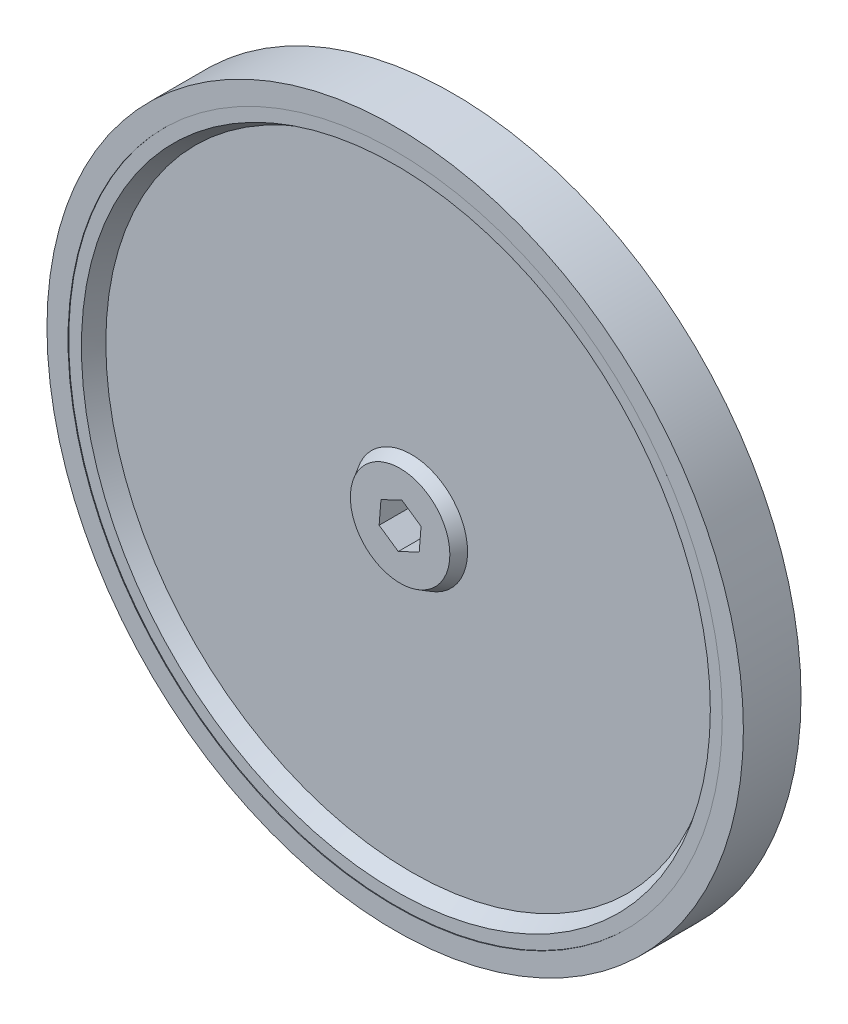
ISO-10303-21;
HEADER;
FILE_DESCRIPTION(('STEP AP214'),'2;1');
FILE_NAME('part.step','',(''),(''),'','','');
FILE_SCHEMA(('AUTOMOTIVE_DESIGN { 1 0 10303 214 1 1 1 1 }'));
ENDSEC;
DATA;
#1=APPLICATION_CONTEXT('core data for automotive mechanical design processes');
#2=APPLICATION_PROTOCOL_DEFINITION('international standard','automotive_design',2000,#1);
#3=PRODUCT_CONTEXT('',#1,'mechanical');
#4=PRODUCT('Part','Part','',(#3));
#5=PRODUCT_RELATED_PRODUCT_CATEGORY('part','',(#4));
#6=PRODUCT_DEFINITION_FORMATION('','',#4);
#7=PRODUCT_DEFINITION_CONTEXT('part definition',#1,'design');
#8=PRODUCT_DEFINITION('design','',#6,#7);
#9=PRODUCT_DEFINITION_SHAPE('','',#8);
#10=(LENGTH_UNIT() NAMED_UNIT(*) SI_UNIT(.MILLI.,.METRE.));
#11=(NAMED_UNIT(*) PLANE_ANGLE_UNIT() SI_UNIT($,.RADIAN.));
#12=(NAMED_UNIT(*) SI_UNIT($,.STERADIAN.) SOLID_ANGLE_UNIT());
#13=UNCERTAINTY_MEASURE_WITH_UNIT(LENGTH_MEASURE(1.E-05),#10,'distance_accuracy_value','');
#14=(GEOMETRIC_REPRESENTATION_CONTEXT(3) GLOBAL_UNCERTAINTY_ASSIGNED_CONTEXT((#13)) GLOBAL_UNIT_ASSIGNED_CONTEXT((#10,
#11,#12)) REPRESENTATION_CONTEXT('',''));
#15=CARTESIAN_POINT('',(0.,0.,0.));
#16=DIRECTION('',(0.,0.,1.));
#17=DIRECTION('',(1.,0.,0.));
#18=AXIS2_PLACEMENT_3D('',#15,#16,#17);
#19=CARTESIAN_POINT('',(0.,0.,-4.5));
#20=DIRECTION('',(0.,0.,-1.));
#21=DIRECTION('',(-1.,0.,0.));
#22=AXIS2_PLACEMENT_3D('',#19,#20,#21);
#23=PLANE('',#22);
#24=CARTESIAN_POINT('',(0.,0.,-4.5));
#25=DIRECTION('',(0.,0.,-1.));
#26=DIRECTION('',(-1.,0.,0.));
#27=AXIS2_PLACEMENT_3D('',#24,#25,#26);
#28=CIRCLE('',#27,108.649573519457);
#29=CARTESIAN_POINT('',(-108.649573519457,0.,-4.5));
#30=VERTEX_POINT('',#29);
#31=EDGE_CURVE('E153',#30,#30,#28,.T.);
#32=ORIENTED_EDGE('',*,*,#31,.T.);
#33=EDGE_LOOP('',(#32));
#34=FACE_BOUND('',#33,.T.);
#35=CARTESIAN_POINT('',(0.,0.,-4.5));
#36=DIRECTION('',(0.,0.,-1.));
#37=DIRECTION('',(-1.,0.,0.));
#38=AXIS2_PLACEMENT_3D('',#35,#36,#37);
#39=CIRCLE('',#38,20.);
#40=CARTESIAN_POINT('',(-20.,0.,-4.5));
#41=VERTEX_POINT('',#40);
#42=EDGE_CURVE('E138',#41,#41,#39,.T.);
#43=ORIENTED_EDGE('',*,*,#42,.F.);
#44=EDGE_LOOP('',(#43));
#45=FACE_BOUND('',#44,.T.);
#46=ADVANCED_FACE('F35',(#34,#45),#23,.T.);
#47=CARTESIAN_POINT('',(0.,0.,4.5));
#48=DIRECTION('',(0.,0.,1.));
#49=DIRECTION('',(1.,0.,0.));
#50=AXIS2_PLACEMENT_3D('',#47,#48,#49);
#51=PLANE('',#50);
#52=CARTESIAN_POINT('',(0.,0.,4.5));
#53=DIRECTION('',(0.,0.,1.));
#54=DIRECTION('',(1.,0.,0.));
#55=AXIS2_PLACEMENT_3D('',#52,#53,#54);
#56=CIRCLE('',#55,108.649573519457);
#57=CARTESIAN_POINT('',(108.649573519457,0.,4.5));
#58=VERTEX_POINT('',#57);
#59=EDGE_CURVE('E43',#58,#58,#56,.T.);
#60=ORIENTED_EDGE('',*,*,#59,.T.);
#61=EDGE_LOOP('',(#60));
#62=FACE_BOUND('',#61,.T.);
#63=CARTESIAN_POINT('',(0.,0.,4.5));
#64=DIRECTION('',(0.,0.,1.));
#65=DIRECTION('',(1.,0.,0.));
#66=AXIS2_PLACEMENT_3D('',#63,#64,#65);
#67=CIRCLE('',#66,20.);
#68=CARTESIAN_POINT('',(20.,0.,4.5));
#69=VERTEX_POINT('',#68);
#70=EDGE_CURVE('E144',#69,#69,#67,.T.);
#71=ORIENTED_EDGE('',*,*,#70,.F.);
#72=EDGE_LOOP('',(#71));
#73=FACE_BOUND('',#72,.T.);
#74=ADVANCED_FACE('F161',(#62,#73),#51,.T.);
#75=CARTESIAN_POINT('',(0.,0.,10.));
#76=DIRECTION('',(0.,0.,-1.));
#77=DIRECTION('',(-1.,0.,0.));
#78=AXIS2_PLACEMENT_3D('',#75,#76,#77);
#79=CYLINDRICAL_SURFACE('',#78,123.825);
#80=CARTESIAN_POINT('',(0.,0.,-10.25));
#81=DIRECTION('',(0.,0.,-1.));
#82=DIRECTION('',(-1.,0.,0.));
#83=AXIS2_PLACEMENT_3D('',#80,#81,#82);
#84=CIRCLE('',#83,123.825);
#85=CARTESIAN_POINT('',(-123.825,0.,-10.25));
#86=VERTEX_POINT('',#85);
#87=EDGE_CURVE('E274',#86,#86,#84,.T.);
#88=ORIENTED_EDGE('',*,*,#87,.F.);
#89=EDGE_LOOP('',(#88));
#90=FACE_BOUND('',#89,.T.);
#91=CARTESIAN_POINT('',(0.,0.,10.25));
#92=DIRECTION('',(0.,0.,1.));
#93=DIRECTION('',(1.,0.,0.));
#94=AXIS2_PLACEMENT_3D('',#91,#92,#93);
#95=CIRCLE('',#94,123.825);
#96=CARTESIAN_POINT('',(123.825,0.,10.25));
#97=VERTEX_POINT('',#96);
#98=EDGE_CURVE('E265',#97,#97,#95,.T.);
#99=ORIENTED_EDGE('',*,*,#98,.F.);
#100=EDGE_LOOP('',(#99));
#101=FACE_BOUND('',#100,.T.);
#102=ADVANCED_FACE('F37',(#90,#101),#79,.T.);
#103=CARTESIAN_POINT('',(0.,0.,10.));
#104=DIRECTION('',(0.,0.,1.));
#105=DIRECTION('',(1.,0.,0.));
#106=AXIS2_PLACEMENT_3D('',#103,#104,#105);
#107=PLANE('',#106);
#108=CARTESIAN_POINT('',(0.,0.,10.));
#109=DIRECTION('',(0.,0.,1.));
#110=DIRECTION('',(1.,0.,0.));
#111=AXIS2_PLACEMENT_3D('',#108,#109,#110);
#112=CIRCLE('',#111,116.325);
#113=CARTESIAN_POINT('',(116.325,0.,10.));
#114=VERTEX_POINT('',#113);
#115=EDGE_CURVE('E11',#114,#114,#112,.F.);
#116=ORIENTED_EDGE('',*,*,#115,.F.);
#117=EDGE_LOOP('',(#116));
#118=FACE_BOUND('',#117,.T.);
#119=CARTESIAN_POINT('',(0.,0.,10.));
#120=DIRECTION('',(0.,0.,1.));
#121=DIRECTION('',(1.,0.,0.));
#122=AXIS2_PLACEMENT_3D('',#119,#120,#121);
#123=CIRCLE('',#122,111.825);
#124=CARTESIAN_POINT('',(111.825,0.,10.));
#125=VERTEX_POINT('',#124);
#126=EDGE_CURVE('E156',#125,#125,#123,.T.);
#127=ORIENTED_EDGE('',*,*,#126,.F.);
#128=EDGE_LOOP('',(#127));
#129=FACE_BOUND('',#128,.T.);
#130=ADVANCED_FACE('F172',(#118,#129),#107,.T.);
#131=CARTESIAN_POINT('',(0.,0.,-10.));
#132=DIRECTION('',(0.,0.,1.));
#133=DIRECTION('',(1.,0.,0.));
#134=AXIS2_PLACEMENT_3D('',#131,#132,#133);
#135=PLANE('',#134);
#136=CARTESIAN_POINT('',(0.,0.,-10.));
#137=DIRECTION('',(0.,0.,-1.));
#138=DIRECTION('',(-1.,0.,0.));
#139=AXIS2_PLACEMENT_3D('',#136,#137,#138);
#140=CIRCLE('',#139,116.325);
#141=CARTESIAN_POINT('',(-116.325,0.,-10.));
#142=VERTEX_POINT('',#141);
#143=EDGE_CURVE('E268',#142,#142,#140,.T.);
#144=ORIENTED_EDGE('',*,*,#143,.T.);
#145=EDGE_LOOP('',(#144));
#146=FACE_BOUND('',#145,.T.);
#147=CARTESIAN_POINT('',(0.,0.,-10.));
#148=DIRECTION('',(0.,0.,-1.));
#149=DIRECTION('',(-1.,0.,0.));
#150=AXIS2_PLACEMENT_3D('',#147,#148,#149);
#151=CIRCLE('',#150,111.825);
#152=CARTESIAN_POINT('',(-111.825,0.,-10.));
#153=VERTEX_POINT('',#152);
#154=EDGE_CURVE('E150',#153,#153,#151,.T.);
#155=ORIENTED_EDGE('',*,*,#154,.F.);
#156=EDGE_LOOP('',(#155));
#157=FACE_BOUND('',#156,.T.);
#158=ADVANCED_FACE('F168',(#146,#157),#135,.F.);
#159=CARTESIAN_POINT('',(0.,0.,10.));
#160=DIRECTION('',(0.,0.,1.));
#161=DIRECTION('',(1.,0.,0.));
#162=AXIS2_PLACEMENT_3D('',#159,#160,#161);
#163=CONICAL_SURFACE('',#162,111.825,0.5235987755983);
#164=ORIENTED_EDGE('',*,*,#59,.F.);
#165=EDGE_LOOP('',(#164));
#166=FACE_BOUND('',#165,.T.);
#167=ORIENTED_EDGE('',*,*,#126,.T.);
#168=EDGE_LOOP('',(#167));
#169=FACE_BOUND('',#168,.T.);
#170=ADVANCED_FACE('F164',(#166,#169),#163,.F.);
#171=CARTESIAN_POINT('',(0.,0.,-10.));
#172=DIRECTION('',(0.,0.,-1.));
#173=DIRECTION('',(-1.,0.,0.));
#174=AXIS2_PLACEMENT_3D('',#171,#172,#173);
#175=CONICAL_SURFACE('',#174,111.825,0.5235987755983);
#176=ORIENTED_EDGE('',*,*,#31,.F.);
#177=EDGE_LOOP('',(#176));
#178=FACE_BOUND('',#177,.T.);
#179=ORIENTED_EDGE('',*,*,#154,.T.);
#180=EDGE_LOOP('',(#179));
#181=FACE_BOUND('',#180,.T.);
#182=ADVANCED_FACE('F167',(#178,#181),#175,.F.);
#183=CARTESIAN_POINT('',(0.,0.,4.5));
#184=DIRECTION('',(0.,0.,-1.));
#185=DIRECTION('',(1.,0.,0.));
#186=AXIS2_PLACEMENT_3D('',#183,#184,#185);
#187=CONICAL_SURFACE('',#186,20.,0.5235987755983);
#188=CARTESIAN_POINT('',(0.,0.,8.5));
#189=DIRECTION('',(0.,0.,1.));
#190=DIRECTION('',(1.,0.,0.));
#191=AXIS2_PLACEMENT_3D('',#188,#189,#190);
#192=CIRCLE('',#191,17.6905989232415);
#193=CARTESIAN_POINT('',(17.6905989232415,0.,8.5));
#194=VERTEX_POINT('',#193);
#195=EDGE_CURVE('E147',#194,#194,#192,.T.);
#196=ORIENTED_EDGE('',*,*,#195,.F.);
#197=EDGE_LOOP('',(#196));
#198=FACE_BOUND('',#197,.T.);
#199=ORIENTED_EDGE('',*,*,#70,.T.);
#200=EDGE_LOOP('',(#199));
#201=FACE_BOUND('',#200,.T.);
#202=ADVANCED_FACE('F193',(#198,#201),#187,.T.);
#203=CARTESIAN_POINT('',(0.,0.,8.5));
#204=DIRECTION('',(0.,0.,1.));
#205=DIRECTION('',(1.,0.,0.));
#206=AXIS2_PLACEMENT_3D('',#203,#204,#205);
#207=PLANE('',#206);
#208=DIRECTION('',(0.824168192044816,-0.56634511671028,0.));
#209=VECTOR('',#208,1.);
#210=CARTESIAN_POINT('',(-4.04882372792991,-5.8920111311972,8.5));
#211=LINE('',#210,#209);
#212=CARTESIAN_POINT('',(-7.45057794059489,-3.55442166197552,8.5));
#213=VERTEX_POINT('',#212);
#214=CARTESIAN_POINT('',(-0.647069515264934,-8.22960060041888,8.5));
#215=VERTEX_POINT('',#214);
#216=EDGE_CURVE('E136',#213,#215,#211,.T.);
#217=ORIENTED_EDGE('',*,*,#216,.F.);
#218=DIRECTION('',(-0.0783851623579573,-0.996923149657042,0.));
#219=VECTOR('',#218,1.);
#220=CARTESIAN_POINT('',(-7.12704318296242,0.560378638233919,8.5));
#221=LINE('',#220,#219);
#222=CARTESIAN_POINT('',(-6.80350842532995,4.67517893844336,8.5));
#223=VERTEX_POINT('',#222);
#224=EDGE_CURVE('E121',#223,#213,#221,.T.);
#225=ORIENTED_EDGE('',*,*,#224,.F.);
#226=DIRECTION('',(-0.902553354402773,-0.430578032946763,0.));
#227=VECTOR('',#226,1.);
#228=CARTESIAN_POINT('',(-3.07821945503251,6.45238976943112,8.5));
#229=LINE('',#228,#227);
#230=CARTESIAN_POINT('',(0.647069515264935,8.22960060041889,8.5));
#231=VERTEX_POINT('',#230);
#232=EDGE_CURVE('E94',#231,#223,#229,.T.);
#233=ORIENTED_EDGE('',*,*,#232,.F.);
#234=DIRECTION('',(-0.824168192044816,0.56634511671028,0.));
#235=VECTOR('',#234,1.);
#236=CARTESIAN_POINT('',(4.04882372792992,5.89201113119721,8.5));
#237=LINE('',#236,#235);
#238=CARTESIAN_POINT('',(7.45057794059489,3.55442166197553,8.5));
#239=VERTEX_POINT('',#238);
#240=EDGE_CURVE('E130',#239,#231,#237,.T.);
#241=ORIENTED_EDGE('',*,*,#240,.F.);
#242=DIRECTION('',(0.0783851623579573,0.996923149657042,0.));
#243=VECTOR('',#242,1.);
#244=CARTESIAN_POINT('',(7.12704318296242,-0.560378638233918,8.5));
#245=LINE('',#244,#243);
#246=CARTESIAN_POINT('',(6.80350842532995,-4.67517893844336,8.5));
#247=VERTEX_POINT('',#246);
#248=EDGE_CURVE('E132',#247,#239,#245,.T.);
#249=ORIENTED_EDGE('',*,*,#248,.F.);
#250=DIRECTION('',(0.902553354402773,0.430578032946762,0.));
#251=VECTOR('',#250,1.);
#252=CARTESIAN_POINT('',(3.07821945503251,-6.45238976943112,8.5));
#253=LINE('',#252,#251);
#254=EDGE_CURVE('E134',#215,#247,#253,.T.);
#255=ORIENTED_EDGE('',*,*,#254,.F.);
#256=EDGE_LOOP('',(#217,#225,#233,#241,#249,#255));
#257=FACE_BOUND('',#256,.T.);
#258=ORIENTED_EDGE('',*,*,#195,.T.);
#259=EDGE_LOOP('',(#258));
#260=FACE_BOUND('',#259,.T.);
#261=ADVANCED_FACE('F200',(#257,#260),#207,.T.);
#262=CARTESIAN_POINT('',(0.,0.,-4.5));
#263=DIRECTION('',(0.,0.,1.));
#264=DIRECTION('',(-1.,0.,0.));
#265=AXIS2_PLACEMENT_3D('',#262,#263,#264);
#266=CONICAL_SURFACE('',#265,20.,0.5235987755983);
#267=CARTESIAN_POINT('',(0.,0.,-8.5));
#268=DIRECTION('',(0.,0.,-1.));
#269=DIRECTION('',(-1.,0.,0.));
#270=AXIS2_PLACEMENT_3D('',#267,#268,#269);
#271=CIRCLE('',#270,17.6905989232415);
#272=CARTESIAN_POINT('',(-17.6905989232415,0.,-8.5));
#273=VERTEX_POINT('',#272);
#274=EDGE_CURVE('E141',#273,#273,#271,.T.);
#275=ORIENTED_EDGE('',*,*,#274,.F.);
#276=EDGE_LOOP('',(#275));
#277=FACE_BOUND('',#276,.T.);
#278=ORIENTED_EDGE('',*,*,#42,.T.);
#279=EDGE_LOOP('',(#278));
#280=FACE_BOUND('',#279,.T.);
#281=ADVANCED_FACE('F209',(#277,#280),#266,.T.);
#282=CARTESIAN_POINT('',(0.,0.,-8.5));
#283=DIRECTION('',(0.,0.,-1.));
#284=DIRECTION('',(-1.,0.,0.));
#285=AXIS2_PLACEMENT_3D('',#282,#283,#284);
#286=PLANE('',#285);
#287=DIRECTION('',(-0.824168192044816,0.56634511671028,0.));
#288=VECTOR('',#287,1.);
#289=CARTESIAN_POINT('',(-0.647069515264934,-8.22960060041888,-8.5));
#290=LINE('',#289,#288);
#291=CARTESIAN_POINT('',(-0.647069515264934,-8.22960060041888,-8.5));
#292=VERTEX_POINT('',#291);
#293=CARTESIAN_POINT('',(-7.45057794059489,-3.55442166197552,-8.5));
#294=VERTEX_POINT('',#293);
#295=EDGE_CURVE('E58',#292,#294,#290,.T.);
#296=ORIENTED_EDGE('',*,*,#295,.F.);
#297=DIRECTION('',(-0.902553354402773,-0.430578032946762,0.));
#298=VECTOR('',#297,1.);
#299=CARTESIAN_POINT('',(6.80350842532995,-4.67517893844336,-8.5));
#300=LINE('',#299,#298);
#301=CARTESIAN_POINT('',(6.80350842532995,-4.67517893844336,-8.5));
#302=VERTEX_POINT('',#301);
#303=EDGE_CURVE('E116',#302,#292,#300,.T.);
#304=ORIENTED_EDGE('',*,*,#303,.F.);
#305=DIRECTION('',(-0.0783851623579573,-0.996923149657042,0.));
#306=VECTOR('',#305,1.);
#307=CARTESIAN_POINT('',(7.45057794059489,3.55442166197553,-8.5));
#308=LINE('',#307,#306);
#309=CARTESIAN_POINT('',(7.45057794059489,3.55442166197553,-8.5));
#310=VERTEX_POINT('',#309);
#311=EDGE_CURVE('E110',#310,#302,#308,.T.);
#312=ORIENTED_EDGE('',*,*,#311,.F.);
#313=DIRECTION('',(0.824168192044815,-0.56634511671028,0.));
#314=VECTOR('',#313,1.);
#315=CARTESIAN_POINT('',(0.647069515264935,8.22960060041889,-8.5));
#316=LINE('',#315,#314);
#317=CARTESIAN_POINT('',(0.647069515264935,8.22960060041889,-8.5));
#318=VERTEX_POINT('',#317);
#319=EDGE_CURVE('E108',#318,#310,#316,.T.);
#320=ORIENTED_EDGE('',*,*,#319,.F.);
#321=DIRECTION('',(0.902553354402773,0.430578032946762,0.));
#322=VECTOR('',#321,1.);
#323=CARTESIAN_POINT('',(-6.80350842532995,4.67517893844336,-8.5));
#324=LINE('',#323,#322);
#325=CARTESIAN_POINT('',(-6.80350842532995,4.67517893844336,-8.5));
#326=VERTEX_POINT('',#325);
#327=EDGE_CURVE('E91',#326,#318,#324,.T.);
#328=ORIENTED_EDGE('',*,*,#327,.F.);
#329=DIRECTION('',(0.0783851623579573,0.996923149657042,0.));
#330=VECTOR('',#329,1.);
#331=CARTESIAN_POINT('',(-7.45057794059489,-3.55442166197552,-8.5));
#332=LINE('',#331,#330);
#333=EDGE_CURVE('E100',#294,#326,#332,.T.);
#334=ORIENTED_EDGE('',*,*,#333,.F.);
#335=EDGE_LOOP('',(#296,#304,#312,#320,#328,#334));
#336=FACE_BOUND('',#335,.T.);
#337=ORIENTED_EDGE('',*,*,#274,.T.);
#338=EDGE_LOOP('',(#337));
#339=FACE_BOUND('',#338,.T.);
#340=ADVANCED_FACE('F104',(#336,#339),#286,.T.);
#341=CARTESIAN_POINT('',(-0.647069515264934,-8.22960060041888,15.5));
#342=DIRECTION('',(-0.56634511671028,-0.824168192044815,0.));
#343=DIRECTION('',(0.824168192044816,-0.56634511671028,0.));
#344=AXIS2_PLACEMENT_3D('',#341,#342,#343);
#345=PLANE('',#344);
#346=ORIENTED_EDGE('',*,*,#216,.T.);
#347=DIRECTION('',(0.,0.,-1.));
#348=VECTOR('',#347,1.);
#349=CARTESIAN_POINT('',(-0.647069515264934,-8.22960060041888,15.5));
#350=LINE('',#349,#348);
#351=EDGE_CURVE('E119',#215,#292,#350,.T.);
#352=ORIENTED_EDGE('',*,*,#351,.T.);
#353=ORIENTED_EDGE('',*,*,#295,.T.);
#354=DIRECTION('',(0.,0.,-1.));
#355=VECTOR('',#354,1.);
#356=CARTESIAN_POINT('',(-7.45057794059489,-3.55442166197552,15.5));
#357=LINE('',#356,#355);
#358=EDGE_CURVE('E97',#213,#294,#357,.T.);
#359=ORIENTED_EDGE('',*,*,#358,.F.);
#360=EDGE_LOOP('',(#346,#352,#353,#359));
#361=FACE_BOUND('',#360,.T.);
#362=ADVANCED_FACE('F224',(#361),#345,.F.);
#363=CARTESIAN_POINT('',(6.80350842532995,-4.67517893844336,15.5));
#364=DIRECTION('',(0.430578032946762,-0.902553354402773,0.));
#365=DIRECTION('',(0.902553354402773,0.430578032946762,0.));
#366=AXIS2_PLACEMENT_3D('',#363,#364,#365);
#367=PLANE('',#366);
#368=ORIENTED_EDGE('',*,*,#254,.T.);
#369=DIRECTION('',(0.,0.,-1.));
#370=VECTOR('',#369,1.);
#371=CARTESIAN_POINT('',(6.80350842532995,-4.67517893844336,15.5));
#372=LINE('',#371,#370);
#373=EDGE_CURVE('E122',#247,#302,#372,.T.);
#374=ORIENTED_EDGE('',*,*,#373,.T.);
#375=ORIENTED_EDGE('',*,*,#303,.T.);
#376=ORIENTED_EDGE('',*,*,#351,.F.);
#377=EDGE_LOOP('',(#368,#374,#375,#376));
#378=FACE_BOUND('',#377,.T.);
#379=ADVANCED_FACE('F227',(#378),#367,.F.);
#380=CARTESIAN_POINT('',(7.45057794059489,3.55442166197553,15.5));
#381=DIRECTION('',(0.996923149657042,-0.0783851623579573,0.));
#382=DIRECTION('',(0.0783851623579573,0.996923149657042,0.));
#383=AXIS2_PLACEMENT_3D('',#380,#381,#382);
#384=PLANE('',#383);
#385=ORIENTED_EDGE('',*,*,#248,.T.);
#386=DIRECTION('',(0.,0.,-1.));
#387=VECTOR('',#386,1.);
#388=CARTESIAN_POINT('',(7.45057794059489,3.55442166197553,15.5));
#389=LINE('',#388,#387);
#390=EDGE_CURVE('E124',#239,#310,#389,.T.);
#391=ORIENTED_EDGE('',*,*,#390,.T.);
#392=ORIENTED_EDGE('',*,*,#311,.T.);
#393=ORIENTED_EDGE('',*,*,#373,.F.);
#394=EDGE_LOOP('',(#385,#391,#392,#393));
#395=FACE_BOUND('',#394,.T.);
#396=ADVANCED_FACE('F236',(#395),#384,.F.);
#397=CARTESIAN_POINT('',(0.647069515264935,8.22960060041889,15.5));
#398=DIRECTION('',(0.56634511671028,0.824168192044816,0.));
#399=DIRECTION('',(-0.824168192044816,0.56634511671028,0.));
#400=AXIS2_PLACEMENT_3D('',#397,#398,#399);
#401=PLANE('',#400);
#402=ORIENTED_EDGE('',*,*,#240,.T.);
#403=DIRECTION('',(0.,0.,-1.));
#404=VECTOR('',#403,1.);
#405=CARTESIAN_POINT('',(0.647069515264935,8.22960060041889,15.5));
#406=LINE('',#405,#404);
#407=EDGE_CURVE('E96',#231,#318,#406,.T.);
#408=ORIENTED_EDGE('',*,*,#407,.T.);
#409=ORIENTED_EDGE('',*,*,#319,.T.);
#410=ORIENTED_EDGE('',*,*,#390,.F.);
#411=EDGE_LOOP('',(#402,#408,#409,#410));
#412=FACE_BOUND('',#411,.T.);
#413=ADVANCED_FACE('F233',(#412),#401,.F.);
#414=CARTESIAN_POINT('',(-6.80350842532995,4.67517893844336,15.5));
#415=DIRECTION('',(-0.430578032946762,0.902553354402773,0.));
#416=DIRECTION('',(-0.902553354402773,-0.430578032946763,0.));
#417=AXIS2_PLACEMENT_3D('',#414,#415,#416);
#418=PLANE('',#417);
#419=ORIENTED_EDGE('',*,*,#232,.T.);
#420=DIRECTION('',(0.,0.,-1.));
#421=VECTOR('',#420,1.);
#422=CARTESIAN_POINT('',(-6.80350842532995,4.67517893844336,15.5));
#423=LINE('',#422,#421);
#424=EDGE_CURVE('E50',#223,#326,#423,.T.);
#425=ORIENTED_EDGE('',*,*,#424,.T.);
#426=ORIENTED_EDGE('',*,*,#327,.T.);
#427=ORIENTED_EDGE('',*,*,#407,.F.);
#428=EDGE_LOOP('',(#419,#425,#426,#427));
#429=FACE_BOUND('',#428,.T.);
#430=ADVANCED_FACE('F88',(#429),#418,.F.);
#431=CARTESIAN_POINT('',(-7.45057794059489,-3.55442166197552,15.5));
#432=DIRECTION('',(-0.996923149657042,0.0783851623579573,0.));
#433=DIRECTION('',(-0.0783851623579573,-0.996923149657042,0.));
#434=AXIS2_PLACEMENT_3D('',#431,#432,#433);
#435=PLANE('',#434);
#436=ORIENTED_EDGE('',*,*,#224,.T.);
#437=ORIENTED_EDGE('',*,*,#358,.T.);
#438=ORIENTED_EDGE('',*,*,#333,.T.);
#439=ORIENTED_EDGE('',*,*,#424,.F.);
#440=EDGE_LOOP('',(#436,#437,#438,#439));
#441=FACE_BOUND('',#440,.T.);
#442=ADVANCED_FACE('F101',(#441),#435,.F.);
#443=CARTESIAN_POINT('',(0.,0.,-10.25));
#444=DIRECTION('',(0.,0.,-1.));
#445=DIRECTION('',(-1.,0.,0.));
#446=AXIS2_PLACEMENT_3D('',#443,#444,#445);
#447=PLANE('',#446);
#448=ORIENTED_EDGE('',*,*,#87,.T.);
#449=EDGE_LOOP('',(#448));
#450=FACE_BOUND('',#449,.T.);
#451=CARTESIAN_POINT('',(0.,0.,-10.25));
#452=DIRECTION('',(0.,0.,-1.));
#453=DIRECTION('',(-1.,0.,0.));
#454=AXIS2_PLACEMENT_3D('',#451,#452,#453);
#455=CIRCLE('',#454,116.325);
#456=CARTESIAN_POINT('',(-116.325,0.,-10.25));
#457=VERTEX_POINT('',#456);
#458=EDGE_CURVE('E271',#457,#457,#455,.T.);
#459=ORIENTED_EDGE('',*,*,#458,.F.);
#460=EDGE_LOOP('',(#459));
#461=FACE_BOUND('',#460,.T.);
#462=ADVANCED_FACE('F230',(#450,#461),#447,.T.);
#463=CARTESIAN_POINT('',(0.,0.,-10.25));
#464=DIRECTION('',(0.,0.,1.));
#465=DIRECTION('',(1.,0.,0.));
#466=AXIS2_PLACEMENT_3D('',#463,#464,#465);
#467=CYLINDRICAL_SURFACE('',#466,116.325);
#468=ORIENTED_EDGE('',*,*,#458,.T.);
#469=EDGE_LOOP('',(#468));
#470=FACE_BOUND('',#469,.T.);
#471=ORIENTED_EDGE('',*,*,#143,.F.);
#472=EDGE_LOOP('',(#471));
#473=FACE_BOUND('',#472,.T.);
#474=ADVANCED_FACE('F246',(#470,#473),#467,.F.);
#475=CARTESIAN_POINT('',(0.,0.,10.25));
#476=DIRECTION('',(0.,0.,1.));
#477=DIRECTION('',(1.,0.,0.));
#478=AXIS2_PLACEMENT_3D('',#475,#476,#477);
#479=PLANE('',#478);
#480=ORIENTED_EDGE('',*,*,#98,.T.);
#481=EDGE_LOOP('',(#480));
#482=FACE_BOUND('',#481,.T.);
#483=CARTESIAN_POINT('',(0.,0.,10.25));
#484=DIRECTION('',(0.,0.,1.));
#485=DIRECTION('',(1.,0.,0.));
#486=AXIS2_PLACEMENT_3D('',#483,#484,#485);
#487=CIRCLE('',#486,116.325);
#488=CARTESIAN_POINT('',(116.325,0.,10.25));
#489=VERTEX_POINT('',#488);
#490=EDGE_CURVE('E263',#489,#489,#487,.T.);
#491=ORIENTED_EDGE('',*,*,#490,.F.);
#492=EDGE_LOOP('',(#491));
#493=FACE_BOUND('',#492,.T.);
#494=ADVANCED_FACE('F250',(#482,#493),#479,.T.);
#495=CARTESIAN_POINT('',(0.,0.,10.25));
#496=DIRECTION('',(0.,0.,-1.));
#497=DIRECTION('',(-1.,0.,0.));
#498=AXIS2_PLACEMENT_3D('',#495,#496,#497);
#499=CYLINDRICAL_SURFACE('',#498,116.325);
#500=ORIENTED_EDGE('',*,*,#490,.T.);
#501=EDGE_LOOP('',(#500));
#502=FACE_BOUND('',#501,.T.);
#503=ORIENTED_EDGE('',*,*,#115,.T.);
#504=EDGE_LOOP('',(#503));
#505=FACE_BOUND('',#504,.T.);
#506=ADVANCED_FACE('F254',(#502,#505),#499,.F.);
#507=CLOSED_SHELL('',(#46,#74,#102,#130,#158,#170,#182,#202,#261,#281,#340,#362,#379,#396,#413,
#430,#442,#462,#474,#494,#506));
#508=MANIFOLD_SOLID_BREP('B2',#507);
#509=ADVANCED_BREP_SHAPE_REPRESENTATION('',(#18,#508),#14);
#510=SHAPE_DEFINITION_REPRESENTATION(#9,#509);
ENDSEC;
END-ISO-10303-21;
